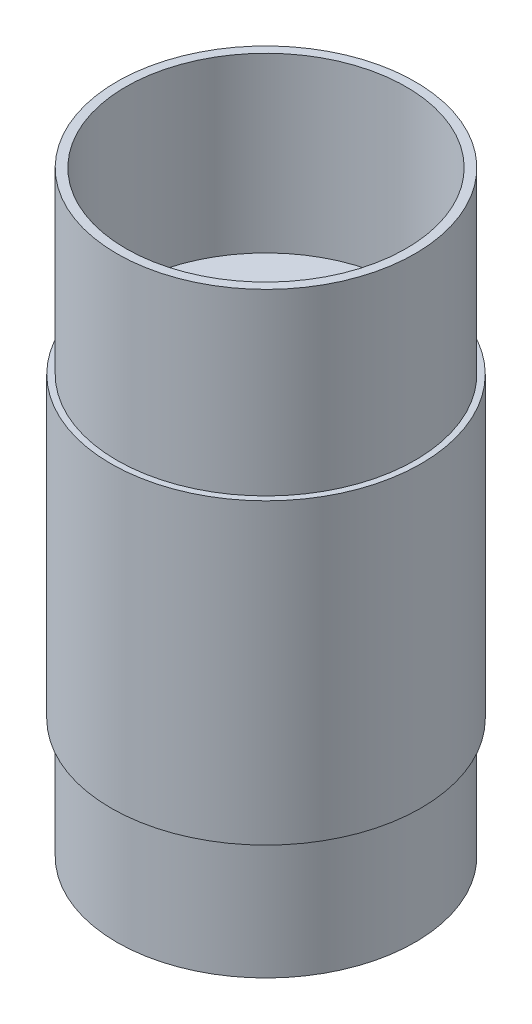
ISO-10303-21;
HEADER;
FILE_DESCRIPTION(('STEP AP214'),'2;1');
FILE_NAME('part.step','',(''),(''),'','','');
FILE_SCHEMA(('AUTOMOTIVE_DESIGN { 1 0 10303 214 1 1 1 1 }'));
ENDSEC;
DATA;
#1=APPLICATION_CONTEXT('core data for automotive mechanical design processes');
#2=APPLICATION_PROTOCOL_DEFINITION('international standard','automotive_design',2000,#1);
#3=PRODUCT_CONTEXT('',#1,'mechanical');
#4=PRODUCT('Part','Part','',(#3));
#5=PRODUCT_RELATED_PRODUCT_CATEGORY('part','',(#4));
#6=PRODUCT_DEFINITION_FORMATION('','',#4);
#7=PRODUCT_DEFINITION_CONTEXT('part definition',#1,'design');
#8=PRODUCT_DEFINITION('design','',#6,#7);
#9=PRODUCT_DEFINITION_SHAPE('','',#8);
#10=(LENGTH_UNIT() NAMED_UNIT(*) SI_UNIT(.MILLI.,.METRE.));
#11=(NAMED_UNIT(*) PLANE_ANGLE_UNIT() SI_UNIT($,.RADIAN.));
#12=(NAMED_UNIT(*) SI_UNIT($,.STERADIAN.) SOLID_ANGLE_UNIT());
#13=UNCERTAINTY_MEASURE_WITH_UNIT(LENGTH_MEASURE(1.E-05),#10,'distance_accuracy_value','');
#14=(GEOMETRIC_REPRESENTATION_CONTEXT(3) GLOBAL_UNCERTAINTY_ASSIGNED_CONTEXT((#13)) GLOBAL_UNIT_ASSIGNED_CONTEXT((#10,
#11,#12)) REPRESENTATION_CONTEXT('',''));
#15=CARTESIAN_POINT('',(0.,0.,0.));
#16=DIRECTION('',(0.,0.,1.));
#17=DIRECTION('',(1.,0.,0.));
#18=AXIS2_PLACEMENT_3D('',#15,#16,#17);
#19=CARTESIAN_POINT('',(0.,100.,0.));
#20=DIRECTION('',(0.,1.,0.));
#21=DIRECTION('',(0.,0.,1.));
#22=AXIS2_PLACEMENT_3D('',#19,#20,#21);
#23=PLANE('',#22);
#24=CARTESIAN_POINT('',(0.,100.,0.));
#25=DIRECTION('',(0.,1.,0.));
#26=DIRECTION('',(0.,0.,1.));
#27=AXIS2_PLACEMENT_3D('',#24,#25,#26);
#28=CIRCLE('',#27,25.);
#29=CARTESIAN_POINT('',(0.,100.,25.));
#30=VERTEX_POINT('',#29);
#31=EDGE_CURVE('E74',#30,#30,#28,.T.);
#32=ORIENTED_EDGE('',*,*,#31,.T.);
#33=EDGE_LOOP('',(#32));
#34=FACE_BOUND('',#33,.T.);
#35=CARTESIAN_POINT('',(0.,100.,0.));
#36=DIRECTION('',(0.,1.,0.));
#37=DIRECTION('',(0.,0.,1.));
#38=AXIS2_PLACEMENT_3D('',#35,#36,#37);
#39=CIRCLE('',#38,23.5);
#40=CARTESIAN_POINT('',(0.,100.,23.5));
#41=VERTEX_POINT('',#40);
#42=EDGE_CURVE('E83',#41,#41,#39,.T.);
#43=ORIENTED_EDGE('',*,*,#42,.F.);
#44=EDGE_LOOP('',(#43));
#45=FACE_BOUND('',#44,.T.);
#46=ADVANCED_FACE('F67',(#34,#45),#23,.T.);
#47=CARTESIAN_POINT('',(0.,70.,0.));
#48=DIRECTION('',(0.,1.,0.));
#49=DIRECTION('',(0.,0.,1.));
#50=AXIS2_PLACEMENT_3D('',#47,#48,#49);
#51=PLANE('',#50);
#52=CARTESIAN_POINT('',(0.,70.,0.));
#53=DIRECTION('',(0.,1.,0.));
#54=DIRECTION('',(0.,0.,1.));
#55=AXIS2_PLACEMENT_3D('',#52,#53,#54);
#56=CIRCLE('',#55,25.);
#57=CARTESIAN_POINT('',(0.,70.,25.));
#58=VERTEX_POINT('',#57);
#59=EDGE_CURVE('E78',#58,#58,#56,.T.);
#60=ORIENTED_EDGE('',*,*,#59,.F.);
#61=EDGE_LOOP('',(#60));
#62=FACE_BOUND('',#61,.T.);
#63=ADVANCED_FACE('F91',(#62),#51,.F.);
#64=CARTESIAN_POINT('',(0.,100.,0.));
#65=DIRECTION('',(0.,-1.,0.));
#66=DIRECTION('',(0.,0.,-1.));
#67=AXIS2_PLACEMENT_3D('',#64,#65,#66);
#68=CYLINDRICAL_SURFACE('',#67,25.);
#69=ORIENTED_EDGE('',*,*,#31,.F.);
#70=EDGE_LOOP('',(#69));
#71=FACE_BOUND('',#70,.T.);
#72=ORIENTED_EDGE('',*,*,#59,.T.);
#73=EDGE_LOOP('',(#72));
#74=FACE_BOUND('',#73,.T.);
#75=ADVANCED_FACE('F69',(#71,#74),#68,.T.);
#76=CARTESIAN_POINT('',(0.,100.,0.));
#77=DIRECTION('',(0.,-1.,0.));
#78=DIRECTION('',(0.,0.,-1.));
#79=AXIS2_PLACEMENT_3D('',#76,#77,#78);
#80=CYLINDRICAL_SURFACE('',#79,23.5);
#81=CARTESIAN_POINT('',(0.,71.,0.));
#82=DIRECTION('',(0.,1.,0.));
#83=DIRECTION('',(0.,0.,1.));
#84=AXIS2_PLACEMENT_3D('',#81,#82,#83);
#85=CIRCLE('',#84,23.5);
#86=CARTESIAN_POINT('',(0.,71.,23.5));
#87=VERTEX_POINT('',#86);
#88=EDGE_CURVE('E12',#87,#87,#85,.T.);
#89=ORIENTED_EDGE('',*,*,#88,.F.);
#90=EDGE_LOOP('',(#89));
#91=FACE_BOUND('',#90,.T.);
#92=ORIENTED_EDGE('',*,*,#42,.T.);
#93=EDGE_LOOP('',(#92));
#94=FACE_BOUND('',#93,.T.);
#95=ADVANCED_FACE('F88',(#91,#94),#80,.F.);
#96=CARTESIAN_POINT('',(0.,71.,0.));
#97=DIRECTION('',(0.,1.,0.));
#98=DIRECTION('',(0.,0.,1.));
#99=AXIS2_PLACEMENT_3D('',#96,#97,#98);
#100=PLANE('',#99);
#101=ORIENTED_EDGE('',*,*,#88,.T.);
#102=EDGE_LOOP('',(#101));
#103=FACE_BOUND('',#102,.T.);
#104=ADVANCED_FACE('F100',(#103),#100,.T.);
#105=CLOSED_SHELL('',(#46,#63,#75,#95,#104));
#106=MANIFOLD_SOLID_BREP('B2',#105);
#107=CARTESIAN_POINT('',(0.,70.,0.));
#108=DIRECTION('',(0.,1.,0.));
#109=DIRECTION('',(0.,0.,1.));
#110=AXIS2_PLACEMENT_3D('',#107,#108,#109);
#111=PLANE('',#110);
#112=CARTESIAN_POINT('',(0.,70.,0.));
#113=DIRECTION('',(0.,1.,0.));
#114=DIRECTION('',(0.,0.,1.));
#115=AXIS2_PLACEMENT_3D('',#112,#113,#114);
#116=CIRCLE('',#115,26.);
#117=CARTESIAN_POINT('',(0.,70.,26.));
#118=VERTEX_POINT('',#117);
#119=EDGE_CURVE('E66',#118,#118,#116,.T.);
#120=ORIENTED_EDGE('',*,*,#119,.T.);
#121=EDGE_LOOP('',(#120));
#122=FACE_BOUND('',#121,.T.);
#123=CARTESIAN_POINT('',(0.,70.,0.));
#124=DIRECTION('',(0.,1.,0.));
#125=DIRECTION('',(0.,0.,1.));
#126=AXIS2_PLACEMENT_3D('',#123,#124,#125);
#127=CIRCLE('',#126,25.);
#128=CARTESIAN_POINT('',(0.,70.,25.));
#129=VERTEX_POINT('',#128);
#130=EDGE_CURVE('E160',#129,#129,#127,.T.);
#131=ORIENTED_EDGE('',*,*,#130,.F.);
#132=EDGE_LOOP('',(#131));
#133=FACE_BOUND('',#132,.T.);
#134=ADVANCED_FACE('F149',(#122,#133),#111,.T.);
#135=CARTESIAN_POINT('',(0.,20.,0.));
#136=DIRECTION('',(0.,1.,0.));
#137=DIRECTION('',(0.,0.,1.));
#138=AXIS2_PLACEMENT_3D('',#135,#136,#137);
#139=PLANE('',#138);
#140=CARTESIAN_POINT('',(0.,20.,0.));
#141=DIRECTION('',(0.,1.,0.));
#142=DIRECTION('',(0.,0.,1.));
#143=AXIS2_PLACEMENT_3D('',#140,#141,#142);
#144=CIRCLE('',#143,26.);
#145=CARTESIAN_POINT('',(0.,20.,26.));
#146=VERTEX_POINT('',#145);
#147=EDGE_CURVE('E153',#146,#146,#144,.T.);
#148=ORIENTED_EDGE('',*,*,#147,.F.);
#149=EDGE_LOOP('',(#148));
#150=FACE_BOUND('',#149,.T.);
#151=CARTESIAN_POINT('',(0.,20.,0.));
#152=DIRECTION('',(0.,1.,0.));
#153=DIRECTION('',(0.,0.,1.));
#154=AXIS2_PLACEMENT_3D('',#151,#152,#153);
#155=CIRCLE('',#154,25.);
#156=CARTESIAN_POINT('',(0.,20.,25.));
#157=VERTEX_POINT('',#156);
#158=EDGE_CURVE('E162',#157,#157,#155,.T.);
#159=ORIENTED_EDGE('',*,*,#158,.T.);
#160=EDGE_LOOP('',(#159));
#161=FACE_BOUND('',#160,.T.);
#162=ADVANCED_FACE('F172',(#150,#161),#139,.F.);
#163=CARTESIAN_POINT('',(0.,70.,0.));
#164=DIRECTION('',(0.,-1.,0.));
#165=DIRECTION('',(0.,0.,-1.));
#166=AXIS2_PLACEMENT_3D('',#163,#164,#165);
#167=CYLINDRICAL_SURFACE('',#166,26.);
#168=ORIENTED_EDGE('',*,*,#119,.F.);
#169=EDGE_LOOP('',(#168));
#170=FACE_BOUND('',#169,.T.);
#171=ORIENTED_EDGE('',*,*,#147,.T.);
#172=EDGE_LOOP('',(#171));
#173=FACE_BOUND('',#172,.T.);
#174=ADVANCED_FACE('F151',(#170,#173),#167,.T.);
#175=CARTESIAN_POINT('',(0.,70.,0.));
#176=DIRECTION('',(0.,-1.,0.));
#177=DIRECTION('',(0.,0.,-1.));
#178=AXIS2_PLACEMENT_3D('',#175,#176,#177);
#179=CYLINDRICAL_SURFACE('',#178,25.);
#180=ORIENTED_EDGE('',*,*,#130,.T.);
#181=EDGE_LOOP('',(#180));
#182=FACE_BOUND('',#181,.T.);
#183=ORIENTED_EDGE('',*,*,#158,.F.);
#184=EDGE_LOOP('',(#183));
#185=FACE_BOUND('',#184,.T.);
#186=ADVANCED_FACE('F168',(#182,#185),#179,.F.);
#187=CLOSED_SHELL('',(#134,#162,#174,#186));
#188=MANIFOLD_SOLID_BREP('B7',#187);
#189=CARTESIAN_POINT('',(0.,20.,0.));
#190=DIRECTION('',(0.,1.,0.));
#191=DIRECTION('',(0.,0.,1.));
#192=AXIS2_PLACEMENT_3D('',#189,#190,#191);
#193=PLANE('',#192);
#194=CARTESIAN_POINT('',(0.,20.,0.));
#195=DIRECTION('',(0.,1.,0.));
#196=DIRECTION('',(0.,0.,1.));
#197=AXIS2_PLACEMENT_3D('',#194,#195,#196);
#198=CIRCLE('',#197,25.);
#199=CARTESIAN_POINT('',(0.,20.,25.));
#200=VERTEX_POINT('',#199);
#201=EDGE_CURVE('E148',#200,#200,#198,.T.);
#202=ORIENTED_EDGE('',*,*,#201,.T.);
#203=EDGE_LOOP('',(#202));
#204=FACE_BOUND('',#203,.T.);
#205=CARTESIAN_POINT('',(0.,20.,0.));
#206=DIRECTION('',(0.,1.,0.));
#207=DIRECTION('',(0.,0.,1.));
#208=AXIS2_PLACEMENT_3D('',#205,#206,#207);
#209=CIRCLE('',#208,23.5);
#210=CARTESIAN_POINT('',(0.,20.,23.5));
#211=VERTEX_POINT('',#210);
#212=EDGE_CURVE('E228',#211,#211,#209,.T.);
#213=ORIENTED_EDGE('',*,*,#212,.F.);
#214=EDGE_LOOP('',(#213));
#215=FACE_BOUND('',#214,.T.);
#216=ADVANCED_FACE('F217',(#204,#215),#193,.T.);
#217=CARTESIAN_POINT('',(0.,0.,0.));
#218=DIRECTION('',(0.,1.,0.));
#219=DIRECTION('',(0.,0.,1.));
#220=AXIS2_PLACEMENT_3D('',#217,#218,#219);
#221=PLANE('',#220);
#222=CARTESIAN_POINT('',(0.,0.,0.));
#223=DIRECTION('',(0.,1.,0.));
#224=DIRECTION('',(0.,0.,1.));
#225=AXIS2_PLACEMENT_3D('',#222,#223,#224);
#226=CIRCLE('',#225,25.);
#227=CARTESIAN_POINT('',(0.,0.,25.));
#228=VERTEX_POINT('',#227);
#229=EDGE_CURVE('E221',#228,#228,#226,.T.);
#230=ORIENTED_EDGE('',*,*,#229,.F.);
#231=EDGE_LOOP('',(#230));
#232=FACE_BOUND('',#231,.T.);
#233=CARTESIAN_POINT('',(0.,0.,0.));
#234=DIRECTION('',(0.,1.,0.));
#235=DIRECTION('',(0.,0.,1.));
#236=AXIS2_PLACEMENT_3D('',#233,#234,#235);
#237=CIRCLE('',#236,23.5);
#238=CARTESIAN_POINT('',(0.,0.,23.5));
#239=VERTEX_POINT('',#238);
#240=EDGE_CURVE('E230',#239,#239,#237,.T.);
#241=ORIENTED_EDGE('',*,*,#240,.T.);
#242=EDGE_LOOP('',(#241));
#243=FACE_BOUND('',#242,.T.);
#244=ADVANCED_FACE('F240',(#232,#243),#221,.F.);
#245=CARTESIAN_POINT('',(0.,20.,0.));
#246=DIRECTION('',(0.,-1.,0.));
#247=DIRECTION('',(0.,0.,-1.));
#248=AXIS2_PLACEMENT_3D('',#245,#246,#247);
#249=CYLINDRICAL_SURFACE('',#248,25.);
#250=ORIENTED_EDGE('',*,*,#201,.F.);
#251=EDGE_LOOP('',(#250));
#252=FACE_BOUND('',#251,.T.);
#253=ORIENTED_EDGE('',*,*,#229,.T.);
#254=EDGE_LOOP('',(#253));
#255=FACE_BOUND('',#254,.T.);
#256=ADVANCED_FACE('F219',(#252,#255),#249,.T.);
#257=CARTESIAN_POINT('',(0.,20.,0.));
#258=DIRECTION('',(0.,-1.,0.));
#259=DIRECTION('',(0.,0.,-1.));
#260=AXIS2_PLACEMENT_3D('',#257,#258,#259);
#261=CYLINDRICAL_SURFACE('',#260,23.5);
#262=ORIENTED_EDGE('',*,*,#212,.T.);
#263=EDGE_LOOP('',(#262));
#264=FACE_BOUND('',#263,.T.);
#265=ORIENTED_EDGE('',*,*,#240,.F.);
#266=EDGE_LOOP('',(#265));
#267=FACE_BOUND('',#266,.T.);
#268=ADVANCED_FACE('F236',(#264,#267),#261,.F.);
#269=CLOSED_SHELL('',(#216,#244,#256,#268));
#270=MANIFOLD_SOLID_BREP('B61',#269);
#271=ADVANCED_BREP_SHAPE_REPRESENTATION('',(#18,#106,#188,#270),#14);
#272=SHAPE_DEFINITION_REPRESENTATION(#9,#271);
ENDSEC;
END-ISO-10303-21;
